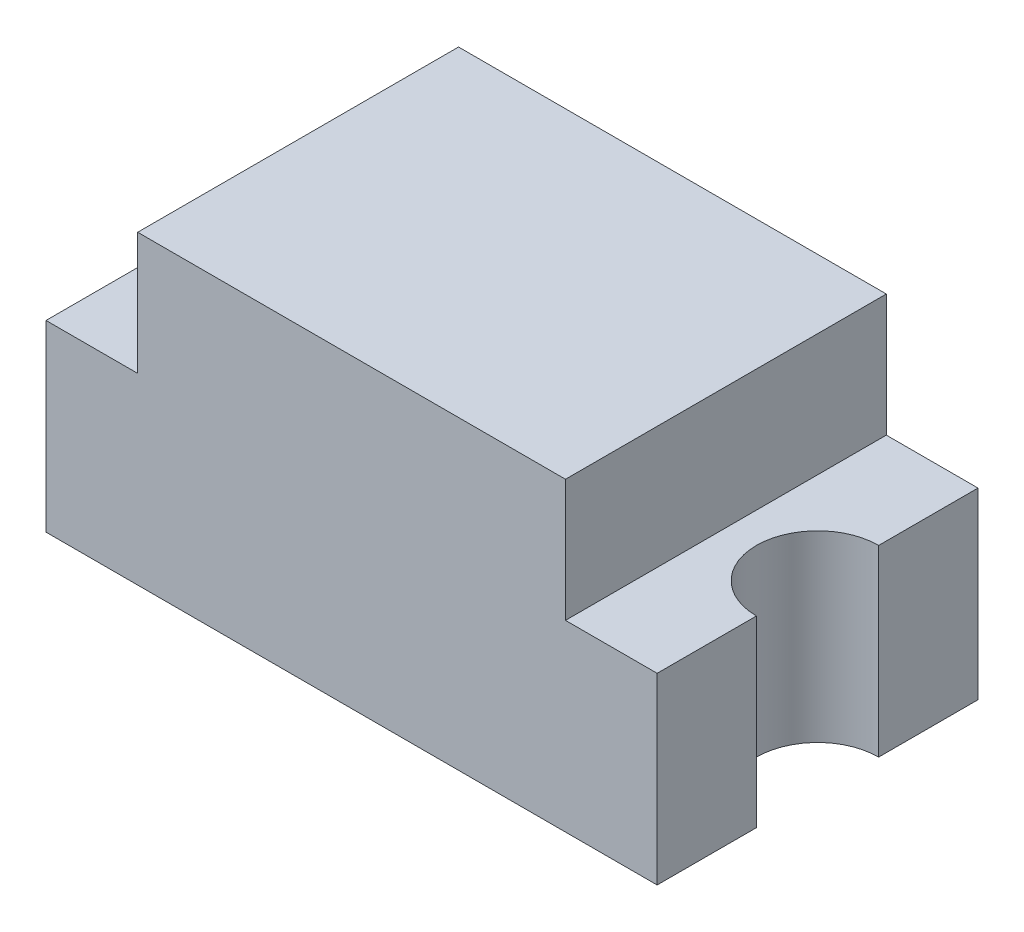
ISO-10303-21;
HEADER;
FILE_DESCRIPTION(('STEP AP214'),'2;1');
FILE_NAME('part.step','',(''),(''),'','','');
FILE_SCHEMA(('AUTOMOTIVE_DESIGN { 1 0 10303 214 1 1 1 1 }'));
ENDSEC;
DATA;
#1=APPLICATION_CONTEXT('core data for automotive mechanical design processes');
#2=APPLICATION_PROTOCOL_DEFINITION('international standard','automotive_design',2000,#1);
#3=PRODUCT_CONTEXT('',#1,'mechanical');
#4=PRODUCT('Part','Part','',(#3));
#5=PRODUCT_RELATED_PRODUCT_CATEGORY('part','',(#4));
#6=PRODUCT_DEFINITION_FORMATION('','',#4);
#7=PRODUCT_DEFINITION_CONTEXT('part definition',#1,'design');
#8=PRODUCT_DEFINITION('design','',#6,#7);
#9=PRODUCT_DEFINITION_SHAPE('','',#8);
#10=(LENGTH_UNIT() NAMED_UNIT(*) SI_UNIT(.MILLI.,.METRE.));
#11=(NAMED_UNIT(*) PLANE_ANGLE_UNIT() SI_UNIT($,.RADIAN.));
#12=(NAMED_UNIT(*) SI_UNIT($,.STERADIAN.) SOLID_ANGLE_UNIT());
#13=UNCERTAINTY_MEASURE_WITH_UNIT(LENGTH_MEASURE(1.E-05),#10,'distance_accuracy_value','');
#14=(GEOMETRIC_REPRESENTATION_CONTEXT(3) GLOBAL_UNCERTAINTY_ASSIGNED_CONTEXT((#13)) GLOBAL_UNIT_ASSIGNED_CONTEXT((#10,
#11,#12)) REPRESENTATION_CONTEXT('',''));
#15=CARTESIAN_POINT('',(0.,0.,0.));
#16=DIRECTION('',(0.,0.,1.));
#17=DIRECTION('',(1.,0.,0.));
#18=AXIS2_PLACEMENT_3D('',#15,#16,#17);
#19=CARTESIAN_POINT('',(0.,0.6,0.));
#20=DIRECTION('',(0.,1.,0.));
#21=DIRECTION('',(0.,0.,1.));
#22=AXIS2_PLACEMENT_3D('',#19,#20,#21);
#23=PLANE('',#22);
#24=DIRECTION('',(0.,0.,-1.));
#25=VECTOR('',#24,1.);
#26=CARTESIAN_POINT('',(0.7,0.6,0.525));
#27=LINE('',#26,#25);
#28=CARTESIAN_POINT('',(0.7,0.6,0.525));
#29=VERTEX_POINT('',#28);
#30=CARTESIAN_POINT('',(0.7,0.6,-0.525));
#31=VERTEX_POINT('',#30);
#32=EDGE_CURVE('E153',#29,#31,#27,.T.);
#33=ORIENTED_EDGE('',*,*,#32,.F.);
#34=DIRECTION('',(1.,0.,0.));
#35=VECTOR('',#34,1.);
#36=CARTESIAN_POINT('',(0.,0.6,0.525));
#37=LINE('',#36,#35);
#38=CARTESIAN_POINT('',(1.,0.6,0.525));
#39=VERTEX_POINT('',#38);
#40=EDGE_CURVE('E176',#29,#39,#37,.T.);
#41=ORIENTED_EDGE('',*,*,#40,.T.);
#42=DIRECTION('',(0.,0.,-1.));
#43=VECTOR('',#42,1.);
#44=CARTESIAN_POINT('',(1.,0.6,0.));
#45=LINE('',#44,#43);
#46=CARTESIAN_POINT('',(1.,0.6,0.2));
#47=VERTEX_POINT('',#46);
#48=EDGE_CURVE('E181',#39,#47,#45,.T.);
#49=ORIENTED_EDGE('',*,*,#48,.T.);
#50=CARTESIAN_POINT('',(1.,0.6,0.));
#51=DIRECTION('',(0.,1.,0.));
#52=DIRECTION('',(0.,0.,1.));
#53=AXIS2_PLACEMENT_3D('',#50,#51,#52);
#54=CIRCLE('',#53,0.2);
#55=CARTESIAN_POINT('',(1.,0.6,-0.2));
#56=VERTEX_POINT('',#55);
#57=EDGE_CURVE('E184',#56,#47,#54,.T.);
#58=ORIENTED_EDGE('',*,*,#57,.F.);
#59=CARTESIAN_POINT('',(1.,0.6,-0.525));
#60=VERTEX_POINT('',#59);
#61=EDGE_CURVE('E185',#56,#60,#45,.T.);
#62=ORIENTED_EDGE('',*,*,#61,.T.);
#63=DIRECTION('',(1.,0.,0.));
#64=VECTOR('',#63,1.);
#65=CARTESIAN_POINT('',(0.,0.6,-0.525));
#66=LINE('',#65,#64);
#67=EDGE_CURVE('E55',#31,#60,#66,.T.);
#68=ORIENTED_EDGE('',*,*,#67,.F.);
#69=EDGE_LOOP('',(#33,#41,#49,#58,#62,#68));
#70=FACE_BOUND('',#69,.T.);
#71=ADVANCED_FACE('F39',(#70),#23,.T.);
#72=CARTESIAN_POINT('',(-1.,0.6,0.));
#73=DIRECTION('',(0.,-1.,0.));
#74=DIRECTION('',(0.,0.,-1.));
#75=AXIS2_PLACEMENT_3D('',#72,#73,#74);
#76=CYLINDRICAL_SURFACE('',#75,0.2);
#77=CARTESIAN_POINT('',(-1.,0.,0.));
#78=DIRECTION('',(0.,1.,0.));
#79=DIRECTION('',(0.,0.,1.));
#80=AXIS2_PLACEMENT_3D('',#77,#78,#79);
#81=CIRCLE('',#80,0.2);
#82=CARTESIAN_POINT('',(-1.,0.,0.2));
#83=VERTEX_POINT('',#82);
#84=CARTESIAN_POINT('',(-1.,0.,-0.2));
#85=VERTEX_POINT('',#84);
#86=EDGE_CURVE('E155',#83,#85,#81,.T.);
#87=ORIENTED_EDGE('',*,*,#86,.F.);
#88=DIRECTION('',(0.,-1.,0.));
#89=VECTOR('',#88,1.);
#90=CARTESIAN_POINT('',(-1.,0.6,0.2));
#91=LINE('',#90,#89);
#92=CARTESIAN_POINT('',(-1.,0.6,0.2));
#93=VERTEX_POINT('',#92);
#94=EDGE_CURVE('E11',#93,#83,#91,.T.);
#95=ORIENTED_EDGE('',*,*,#94,.F.);
#96=CARTESIAN_POINT('',(-1.,0.6,0.));
#97=DIRECTION('',(0.,1.,0.));
#98=DIRECTION('',(0.,0.,1.));
#99=AXIS2_PLACEMENT_3D('',#96,#97,#98);
#100=CIRCLE('',#99,0.2);
#101=CARTESIAN_POINT('',(-1.,0.6,-0.2));
#102=VERTEX_POINT('',#101);
#103=EDGE_CURVE('E167',#93,#102,#100,.T.);
#104=ORIENTED_EDGE('',*,*,#103,.T.);
#105=DIRECTION('',(0.,-1.,0.));
#106=VECTOR('',#105,1.);
#107=CARTESIAN_POINT('',(-1.,0.6,-0.2));
#108=LINE('',#107,#106);
#109=EDGE_CURVE('E210',#102,#85,#108,.T.);
#110=ORIENTED_EDGE('',*,*,#109,.T.);
#111=EDGE_LOOP('',(#87,#95,#104,#110));
#112=FACE_BOUND('',#111,.T.);
#113=ADVANCED_FACE('F41',(#112),#76,.F.);
#114=CARTESIAN_POINT('',(-1.,0.6,0.));
#115=DIRECTION('',(-1.,0.,0.));
#116=DIRECTION('',(0.,0.,1.));
#117=AXIS2_PLACEMENT_3D('',#114,#115,#116);
#118=PLANE('',#117);
#119=DIRECTION('',(0.,0.,-1.));
#120=VECTOR('',#119,1.);
#121=CARTESIAN_POINT('',(-1.,0.,0.));
#122=LINE('',#121,#120);
#123=CARTESIAN_POINT('',(-1.,0.,0.525));
#124=VERTEX_POINT('',#123);
#125=EDGE_CURVE('E160',#124,#83,#122,.T.);
#126=ORIENTED_EDGE('',*,*,#125,.F.);
#127=DIRECTION('',(0.,-1.,0.));
#128=VECTOR('',#127,1.);
#129=CARTESIAN_POINT('',(-1.,0.6,0.525));
#130=LINE('',#129,#128);
#131=CARTESIAN_POINT('',(-1.,0.6,0.525));
#132=VERTEX_POINT('',#131);
#133=EDGE_CURVE('E48',#132,#124,#130,.T.);
#134=ORIENTED_EDGE('',*,*,#133,.F.);
#135=DIRECTION('',(0.,0.,-1.));
#136=VECTOR('',#135,1.);
#137=CARTESIAN_POINT('',(-1.,0.6,0.));
#138=LINE('',#137,#136);
#139=EDGE_CURVE('E171',#132,#93,#138,.T.);
#140=ORIENTED_EDGE('',*,*,#139,.T.);
#141=ORIENTED_EDGE('',*,*,#94,.T.);
#142=EDGE_LOOP('',(#126,#134,#140,#141));
#143=FACE_BOUND('',#142,.T.);
#144=ADVANCED_FACE('F241',(#143),#118,.T.);
#145=CARTESIAN_POINT('',(0.,0.6,0.525));
#146=DIRECTION('',(0.,0.,-1.));
#147=DIRECTION('',(-1.,0.,0.));
#148=AXIS2_PLACEMENT_3D('',#145,#146,#147);
#149=PLANE('',#148);
#150=DIRECTION('',(1.,0.,0.));
#151=VECTOR('',#150,1.);
#152=CARTESIAN_POINT('',(0.,0.,0.525));
#153=LINE('',#152,#151);
#154=CARTESIAN_POINT('',(1.,0.,0.525));
#155=VERTEX_POINT('',#154);
#156=EDGE_CURVE('E195',#124,#155,#153,.T.);
#157=ORIENTED_EDGE('',*,*,#156,.T.);
#158=DIRECTION('',(0.,-1.,0.));
#159=VECTOR('',#158,1.);
#160=CARTESIAN_POINT('',(1.,0.6,0.525));
#161=LINE('',#160,#159);
#162=EDGE_CURVE('E225',#39,#155,#161,.T.);
#163=ORIENTED_EDGE('',*,*,#162,.F.);
#164=ORIENTED_EDGE('',*,*,#40,.F.);
#165=DIRECTION('',(0.,-1.,0.));
#166=VECTOR('',#165,1.);
#167=CARTESIAN_POINT('',(0.7,1.,0.525));
#168=LINE('',#167,#166);
#169=CARTESIAN_POINT('',(0.7,1.,0.525));
#170=VERTEX_POINT('',#169);
#171=EDGE_CURVE('E255',#170,#29,#168,.T.);
#172=ORIENTED_EDGE('',*,*,#171,.F.);
#173=DIRECTION('',(1.,0.,0.));
#174=VECTOR('',#173,1.);
#175=CARTESIAN_POINT('',(-0.7,1.,0.525));
#176=LINE('',#175,#174);
#177=CARTESIAN_POINT('',(-0.7,1.,0.525));
#178=VERTEX_POINT('',#177);
#179=EDGE_CURVE('E146',#178,#170,#176,.T.);
#180=ORIENTED_EDGE('',*,*,#179,.F.);
#181=DIRECTION('',(0.,-1.,0.));
#182=VECTOR('',#181,1.);
#183=CARTESIAN_POINT('',(-0.7,1.,0.525));
#184=LINE('',#183,#182);
#185=CARTESIAN_POINT('',(-0.7,0.6,0.525));
#186=VERTEX_POINT('',#185);
#187=EDGE_CURVE('E163',#178,#186,#184,.T.);
#188=ORIENTED_EDGE('',*,*,#187,.T.);
#189=EDGE_CURVE('E178',#132,#186,#37,.T.);
#190=ORIENTED_EDGE('',*,*,#189,.F.);
#191=ORIENTED_EDGE('',*,*,#133,.T.);
#192=EDGE_LOOP('',(#157,#163,#164,#172,#180,#188,#190,#191));
#193=FACE_BOUND('',#192,.T.);
#194=ADVANCED_FACE('F232',(#193),#149,.F.);
#195=CARTESIAN_POINT('',(1.,0.6,0.));
#196=DIRECTION('',(-1.,0.,0.));
#197=DIRECTION('',(0.,0.,1.));
#198=AXIS2_PLACEMENT_3D('',#195,#196,#197);
#199=PLANE('',#198);
#200=DIRECTION('',(0.,0.,-1.));
#201=VECTOR('',#200,1.);
#202=CARTESIAN_POINT('',(1.,0.,0.));
#203=LINE('',#202,#201);
#204=CARTESIAN_POINT('',(1.,0.,0.2));
#205=VERTEX_POINT('',#204);
#206=EDGE_CURVE('E198',#155,#205,#203,.T.);
#207=ORIENTED_EDGE('',*,*,#206,.T.);
#208=DIRECTION('',(0.,-1.,0.));
#209=VECTOR('',#208,1.);
#210=CARTESIAN_POINT('',(1.,0.6,0.2));
#211=LINE('',#210,#209);
#212=EDGE_CURVE('E222',#47,#205,#211,.T.);
#213=ORIENTED_EDGE('',*,*,#212,.F.);
#214=ORIENTED_EDGE('',*,*,#48,.F.);
#215=ORIENTED_EDGE('',*,*,#162,.T.);
#216=EDGE_LOOP('',(#207,#213,#214,#215));
#217=FACE_BOUND('',#216,.T.);
#218=ADVANCED_FACE('F301',(#217),#199,.F.);
#219=CARTESIAN_POINT('',(1.,0.6,0.));
#220=DIRECTION('',(0.,-1.,0.));
#221=DIRECTION('',(0.,0.,-1.));
#222=AXIS2_PLACEMENT_3D('',#219,#220,#221);
#223=CYLINDRICAL_SURFACE('',#222,0.2);
#224=CARTESIAN_POINT('',(1.,0.,0.));
#225=DIRECTION('',(0.,1.,0.));
#226=DIRECTION('',(0.,0.,1.));
#227=AXIS2_PLACEMENT_3D('',#224,#225,#226);
#228=CIRCLE('',#227,0.2);
#229=CARTESIAN_POINT('',(1.,0.,-0.2));
#230=VERTEX_POINT('',#229);
#231=EDGE_CURVE('E202',#230,#205,#228,.T.);
#232=ORIENTED_EDGE('',*,*,#231,.F.);
#233=DIRECTION('',(0.,-1.,0.));
#234=VECTOR('',#233,1.);
#235=CARTESIAN_POINT('',(1.,0.6,-0.2));
#236=LINE('',#235,#234);
#237=EDGE_CURVE('E219',#56,#230,#236,.T.);
#238=ORIENTED_EDGE('',*,*,#237,.F.);
#239=ORIENTED_EDGE('',*,*,#57,.T.);
#240=ORIENTED_EDGE('',*,*,#212,.T.);
#241=EDGE_LOOP('',(#232,#238,#239,#240));
#242=FACE_BOUND('',#241,.T.);
#243=ADVANCED_FACE('F305',(#242),#223,.F.);
#244=CARTESIAN_POINT('',(1.,0.,-0.525));
#245=VERTEX_POINT('',#244);
#246=EDGE_CURVE('E203',#230,#245,#203,.T.);
#247=ORIENTED_EDGE('',*,*,#246,.T.);
#248=DIRECTION('',(0.,-1.,0.));
#249=VECTOR('',#248,1.);
#250=CARTESIAN_POINT('',(1.,0.6,-0.525));
#251=LINE('',#250,#249);
#252=EDGE_CURVE('E216',#60,#245,#251,.T.);
#253=ORIENTED_EDGE('',*,*,#252,.F.);
#254=ORIENTED_EDGE('',*,*,#61,.F.);
#255=ORIENTED_EDGE('',*,*,#237,.T.);
#256=EDGE_LOOP('',(#247,#253,#254,#255));
#257=FACE_BOUND('',#256,.T.);
#258=ADVANCED_FACE('F295',(#257),#199,.F.);
#259=CARTESIAN_POINT('',(0.,0.6,-0.525));
#260=DIRECTION('',(0.,0.,-1.));
#261=DIRECTION('',(-1.,0.,0.));
#262=AXIS2_PLACEMENT_3D('',#259,#260,#261);
#263=PLANE('',#262);
#264=DIRECTION('',(1.,0.,0.));
#265=VECTOR('',#264,1.);
#266=CARTESIAN_POINT('',(0.,0.,-0.525));
#267=LINE('',#266,#265);
#268=CARTESIAN_POINT('',(-1.,0.,-0.525));
#269=VERTEX_POINT('',#268);
#270=EDGE_CURVE('E206',#269,#245,#267,.T.);
#271=ORIENTED_EDGE('',*,*,#270,.F.);
#272=DIRECTION('',(0.,-1.,0.));
#273=VECTOR('',#272,1.);
#274=CARTESIAN_POINT('',(-1.,0.6,-0.525));
#275=LINE('',#274,#273);
#276=CARTESIAN_POINT('',(-1.,0.6,-0.525));
#277=VERTEX_POINT('',#276);
#278=EDGE_CURVE('E213',#277,#269,#275,.T.);
#279=ORIENTED_EDGE('',*,*,#278,.F.);
#280=CARTESIAN_POINT('',(-0.7,0.6,-0.525));
#281=VERTEX_POINT('',#280);
#282=EDGE_CURVE('E189',#277,#281,#66,.T.);
#283=ORIENTED_EDGE('',*,*,#282,.T.);
#284=DIRECTION('',(0.,-1.,0.));
#285=VECTOR('',#284,1.);
#286=CARTESIAN_POINT('',(-0.7,1.,-0.525));
#287=LINE('',#286,#285);
#288=CARTESIAN_POINT('',(-0.7,1.,-0.525));
#289=VERTEX_POINT('',#288);
#290=EDGE_CURVE('E136',#289,#281,#287,.T.);
#291=ORIENTED_EDGE('',*,*,#290,.F.);
#292=DIRECTION('',(-1.,0.,0.));
#293=VECTOR('',#292,1.);
#294=CARTESIAN_POINT('',(-0.7,1.,-0.525));
#295=LINE('',#294,#293);
#296=CARTESIAN_POINT('',(0.7,1.,-0.525));
#297=VERTEX_POINT('',#296);
#298=EDGE_CURVE('E128',#297,#289,#295,.T.);
#299=ORIENTED_EDGE('',*,*,#298,.F.);
#300=DIRECTION('',(0.,-1.,0.));
#301=VECTOR('',#300,1.);
#302=CARTESIAN_POINT('',(0.7,1.,-0.525));
#303=LINE('',#302,#301);
#304=EDGE_CURVE('E133',#297,#31,#303,.T.);
#305=ORIENTED_EDGE('',*,*,#304,.T.);
#306=ORIENTED_EDGE('',*,*,#67,.T.);
#307=ORIENTED_EDGE('',*,*,#252,.T.);
#308=EDGE_LOOP('',(#271,#279,#283,#291,#299,#305,#306,#307));
#309=FACE_BOUND('',#308,.T.);
#310=ADVANCED_FACE('F131',(#309),#263,.T.);
#311=EDGE_CURVE('E172',#85,#269,#122,.T.);
#312=ORIENTED_EDGE('',*,*,#311,.F.);
#313=ORIENTED_EDGE('',*,*,#109,.F.);
#314=EDGE_CURVE('E177',#102,#277,#138,.T.);
#315=ORIENTED_EDGE('',*,*,#314,.T.);
#316=ORIENTED_EDGE('',*,*,#278,.T.);
#317=EDGE_LOOP('',(#312,#313,#315,#316));
#318=FACE_BOUND('',#317,.T.);
#319=ADVANCED_FACE('F248',(#318),#118,.T.);
#320=DIRECTION('',(0.,0.,1.));
#321=VECTOR('',#320,1.);
#322=CARTESIAN_POINT('',(-0.7,0.6,0.525));
#323=LINE('',#322,#321);
#324=EDGE_CURVE('E63',#281,#186,#323,.T.);
#325=ORIENTED_EDGE('',*,*,#324,.F.);
#326=ORIENTED_EDGE('',*,*,#282,.F.);
#327=ORIENTED_EDGE('',*,*,#314,.F.);
#328=ORIENTED_EDGE('',*,*,#103,.F.);
#329=ORIENTED_EDGE('',*,*,#139,.F.);
#330=ORIENTED_EDGE('',*,*,#189,.T.);
#331=EDGE_LOOP('',(#325,#326,#327,#328,#329,#330));
#332=FACE_BOUND('',#331,.T.);
#333=ADVANCED_FACE('F281',(#332),#23,.T.);
#334=CARTESIAN_POINT('',(0.,0.,0.));
#335=DIRECTION('',(0.,1.,0.));
#336=DIRECTION('',(0.,0.,1.));
#337=AXIS2_PLACEMENT_3D('',#334,#335,#336);
#338=PLANE('',#337);
#339=ORIENTED_EDGE('',*,*,#86,.T.);
#340=ORIENTED_EDGE('',*,*,#311,.T.);
#341=ORIENTED_EDGE('',*,*,#270,.T.);
#342=ORIENTED_EDGE('',*,*,#246,.F.);
#343=ORIENTED_EDGE('',*,*,#231,.T.);
#344=ORIENTED_EDGE('',*,*,#206,.F.);
#345=ORIENTED_EDGE('',*,*,#156,.F.);
#346=ORIENTED_EDGE('',*,*,#125,.T.);
#347=EDGE_LOOP('',(#339,#340,#341,#342,#343,#344,#345,#346));
#348=FACE_BOUND('',#347,.T.);
#349=ADVANCED_FACE('F240',(#348),#338,.F.);
#350=CARTESIAN_POINT('',(0.7,1.,0.525));
#351=DIRECTION('',(-1.,0.,0.));
#352=DIRECTION('',(0.,0.,1.));
#353=AXIS2_PLACEMENT_3D('',#350,#351,#352);
#354=PLANE('',#353);
#355=ORIENTED_EDGE('',*,*,#32,.T.);
#356=ORIENTED_EDGE('',*,*,#304,.F.);
#357=DIRECTION('',(0.,0.,-1.));
#358=VECTOR('',#357,1.);
#359=CARTESIAN_POINT('',(0.7,1.,0.525));
#360=LINE('',#359,#358);
#361=EDGE_CURVE('E141',#170,#297,#360,.T.);
#362=ORIENTED_EDGE('',*,*,#361,.F.);
#363=ORIENTED_EDGE('',*,*,#171,.T.);
#364=EDGE_LOOP('',(#355,#356,#362,#363));
#365=FACE_BOUND('',#364,.T.);
#366=ADVANCED_FACE('F152',(#365),#354,.F.);
#367=CARTESIAN_POINT('',(-0.7,1.,0.525));
#368=DIRECTION('',(1.,0.,0.));
#369=DIRECTION('',(0.,0.,-1.));
#370=AXIS2_PLACEMENT_3D('',#367,#368,#369);
#371=PLANE('',#370);
#372=ORIENTED_EDGE('',*,*,#324,.T.);
#373=ORIENTED_EDGE('',*,*,#187,.F.);
#374=DIRECTION('',(0.,0.,1.));
#375=VECTOR('',#374,1.);
#376=CARTESIAN_POINT('',(-0.7,1.,0.525));
#377=LINE('',#376,#375);
#378=EDGE_CURVE('E140',#289,#178,#377,.T.);
#379=ORIENTED_EDGE('',*,*,#378,.F.);
#380=ORIENTED_EDGE('',*,*,#290,.T.);
#381=EDGE_LOOP('',(#372,#373,#379,#380));
#382=FACE_BOUND('',#381,.T.);
#383=ADVANCED_FACE('F270',(#382),#371,.F.);
#384=CARTESIAN_POINT('',(0.,1.,0.));
#385=DIRECTION('',(0.,-1.,0.));
#386=DIRECTION('',(0.,0.,-1.));
#387=AXIS2_PLACEMENT_3D('',#384,#385,#386);
#388=PLANE('',#387);
#389=ORIENTED_EDGE('',*,*,#361,.T.);
#390=ORIENTED_EDGE('',*,*,#298,.T.);
#391=ORIENTED_EDGE('',*,*,#378,.T.);
#392=ORIENTED_EDGE('',*,*,#179,.T.);
#393=EDGE_LOOP('',(#389,#390,#391,#392));
#394=FACE_BOUND('',#393,.T.);
#395=ADVANCED_FACE('F144',(#394),#388,.F.);
#396=CLOSED_SHELL('',(#71,#113,#144,#194,#218,#243,#258,#310,#319,#333,#349,#366,#383,#395));
#397=MANIFOLD_SOLID_BREP('B2',#396);
#398=ADVANCED_BREP_SHAPE_REPRESENTATION('',(#18,#397),#14);
#399=SHAPE_DEFINITION_REPRESENTATION(#9,#398);
ENDSEC;
END-ISO-10303-21;
